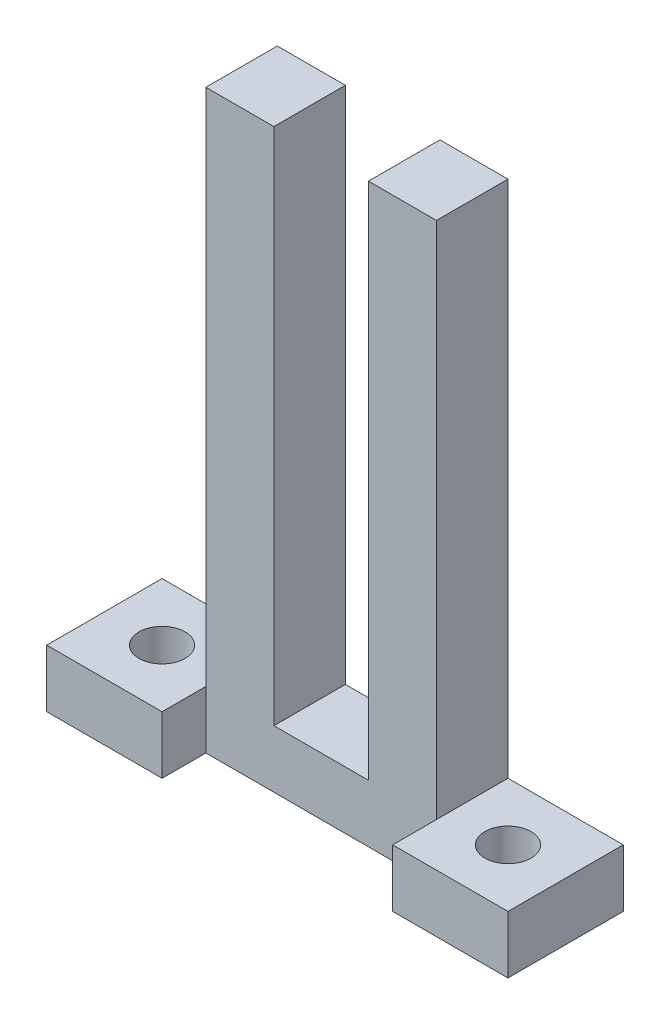
ISO-10303-21;
HEADER;
FILE_DESCRIPTION(('STEP AP214'),'2;1');
FILE_NAME('part.step','',(''),(''),'','','');
FILE_SCHEMA(('AUTOMOTIVE_DESIGN { 1 0 10303 214 1 1 1 1 }'));
ENDSEC;
DATA;
#1=APPLICATION_CONTEXT('core data for automotive mechanical design processes');
#2=APPLICATION_PROTOCOL_DEFINITION('international standard','automotive_design',2000,#1);
#3=PRODUCT_CONTEXT('',#1,'mechanical');
#4=PRODUCT('Part','Part','',(#3));
#5=PRODUCT_RELATED_PRODUCT_CATEGORY('part','',(#4));
#6=PRODUCT_DEFINITION_FORMATION('','',#4);
#7=PRODUCT_DEFINITION_CONTEXT('part definition',#1,'design');
#8=PRODUCT_DEFINITION('design','',#6,#7);
#9=PRODUCT_DEFINITION_SHAPE('','',#8);
#10=(LENGTH_UNIT() NAMED_UNIT(*) SI_UNIT(.MILLI.,.METRE.));
#11=(NAMED_UNIT(*) PLANE_ANGLE_UNIT() SI_UNIT($,.RADIAN.));
#12=(NAMED_UNIT(*) SI_UNIT($,.STERADIAN.) SOLID_ANGLE_UNIT());
#13=UNCERTAINTY_MEASURE_WITH_UNIT(LENGTH_MEASURE(1.E-05),#10,'distance_accuracy_value','');
#14=(GEOMETRIC_REPRESENTATION_CONTEXT(3) GLOBAL_UNCERTAINTY_ASSIGNED_CONTEXT((#13)) GLOBAL_UNIT_ASSIGNED_CONTEXT((#10,
#11,#12)) REPRESENTATION_CONTEXT('',''));
#15=CARTESIAN_POINT('',(0.,0.,0.));
#16=DIRECTION('',(0.,0.,1.));
#17=DIRECTION('',(1.,0.,0.));
#18=AXIS2_PLACEMENT_3D('',#15,#16,#17);
#19=CARTESIAN_POINT('',(0.,50.,0.));
#20=DIRECTION('',(0.,0.,-1.));
#21=DIRECTION('',(-1.,0.,0.));
#22=AXIS2_PLACEMENT_3D('',#19,#20,#21);
#23=PLANE('',#22);
#24=DIRECTION('',(0.,-1.,0.));
#25=VECTOR('',#24,1.);
#26=CARTESIAN_POINT('',(20.,5.,0.));
#27=LINE('',#26,#25);
#28=CARTESIAN_POINT('',(20.,5.,0.));
#29=VERTEX_POINT('',#28);
#30=CARTESIAN_POINT('',(20.,0.,0.));
#31=VERTEX_POINT('',#30);
#32=EDGE_CURVE('E161',#29,#31,#27,.T.);
#33=ORIENTED_EDGE('',*,*,#32,.F.);
#34=DIRECTION('',(0.,-1.,0.));
#35=VECTOR('',#34,1.);
#36=CARTESIAN_POINT('',(20.,50.,0.));
#37=LINE('',#36,#35);
#38=CARTESIAN_POINT('',(20.,50.,0.));
#39=VERTEX_POINT('',#38);
#40=EDGE_CURVE('E200',#39,#29,#37,.T.);
#41=ORIENTED_EDGE('',*,*,#40,.F.);
#42=DIRECTION('',(1.,0.,0.));
#43=VECTOR('',#42,1.);
#44=CARTESIAN_POINT('',(14.1,50.,0.));
#45=LINE('',#44,#43);
#46=CARTESIAN_POINT('',(14.1,50.,0.));
#47=VERTEX_POINT('',#46);
#48=EDGE_CURVE('E188',#47,#39,#45,.T.);
#49=ORIENTED_EDGE('',*,*,#48,.F.);
#50=DIRECTION('',(0.,-1.,0.));
#51=VECTOR('',#50,1.);
#52=CARTESIAN_POINT('',(14.1,50.,0.));
#53=LINE('',#52,#51);
#54=CARTESIAN_POINT('',(14.1,5.,0.));
#55=VERTEX_POINT('',#54);
#56=EDGE_CURVE('E203',#47,#55,#53,.T.);
#57=ORIENTED_EDGE('',*,*,#56,.T.);
#58=DIRECTION('',(1.,0.,0.));
#59=VECTOR('',#58,1.);
#60=CARTESIAN_POINT('',(-10.,5.,0.));
#61=LINE('',#60,#59);
#62=CARTESIAN_POINT('',(5.9,5.,0.));
#63=VERTEX_POINT('',#62);
#64=EDGE_CURVE('E209',#63,#55,#61,.T.);
#65=ORIENTED_EDGE('',*,*,#64,.F.);
#66=DIRECTION('',(0.,-1.,0.));
#67=VECTOR('',#66,1.);
#68=CARTESIAN_POINT('',(5.9,50.,0.));
#69=LINE('',#68,#67);
#70=CARTESIAN_POINT('',(5.9,50.,0.));
#71=VERTEX_POINT('',#70);
#72=EDGE_CURVE('E286',#71,#63,#69,.T.);
#73=ORIENTED_EDGE('',*,*,#72,.F.);
#74=DIRECTION('',(1.,0.,0.));
#75=VECTOR('',#74,1.);
#76=CARTESIAN_POINT('',(0.,50.,0.));
#77=LINE('',#76,#75);
#78=CARTESIAN_POINT('',(0.,50.,0.));
#79=VERTEX_POINT('',#78);
#80=EDGE_CURVE('E234',#79,#71,#77,.T.);
#81=ORIENTED_EDGE('',*,*,#80,.F.);
#82=DIRECTION('',(0.,-1.,0.));
#83=VECTOR('',#82,1.);
#84=CARTESIAN_POINT('',(0.,50.,0.));
#85=LINE('',#84,#83);
#86=CARTESIAN_POINT('',(0.,5.,0.));
#87=VERTEX_POINT('',#86);
#88=EDGE_CURVE('E263',#79,#87,#85,.T.);
#89=ORIENTED_EDGE('',*,*,#88,.T.);
#90=DIRECTION('',(0.,1.,0.));
#91=VECTOR('',#90,1.);
#92=CARTESIAN_POINT('',(0.,5.,0.));
#93=LINE('',#92,#91);
#94=CARTESIAN_POINT('',(0.,0.,0.));
#95=VERTEX_POINT('',#94);
#96=EDGE_CURVE('E48',#95,#87,#93,.T.);
#97=ORIENTED_EDGE('',*,*,#96,.F.);
#98=DIRECTION('',(1.,0.,0.));
#99=VECTOR('',#98,1.);
#100=CARTESIAN_POINT('',(0.,0.,0.));
#101=LINE('',#100,#99);
#102=EDGE_CURVE('E230',#95,#31,#101,.T.);
#103=ORIENTED_EDGE('',*,*,#102,.T.);
#104=EDGE_LOOP('',(#33,#41,#49,#57,#65,#73,#81,#89,#97,#103));
#105=FACE_BOUND('',#104,.T.);
#106=ADVANCED_FACE('F31',(#105),#23,.F.);
#107=CARTESIAN_POINT('',(-10.,5.,0.));
#108=DIRECTION('',(0.,1.,0.));
#109=DIRECTION('',(0.,0.,1.));
#110=AXIS2_PLACEMENT_3D('',#107,#108,#109);
#111=PLANE('',#110);
#112=ORIENTED_EDGE('',*,*,#64,.T.);
#113=DIRECTION('',(0.,0.,-1.));
#114=VECTOR('',#113,1.);
#115=CARTESIAN_POINT('',(14.1,5.,0.));
#116=LINE('',#115,#114);
#117=CARTESIAN_POINT('',(14.1,5.,-6.2));
#118=VERTEX_POINT('',#117);
#119=EDGE_CURVE('E11',#55,#118,#116,.T.);
#120=ORIENTED_EDGE('',*,*,#119,.T.);
#121=DIRECTION('',(-1.,0.,0.));
#122=VECTOR('',#121,1.);
#123=CARTESIAN_POINT('',(-10.,5.,-6.2));
#124=LINE('',#123,#122);
#125=CARTESIAN_POINT('',(5.9,5.,-6.2));
#126=VERTEX_POINT('',#125);
#127=EDGE_CURVE('E216',#118,#126,#124,.T.);
#128=ORIENTED_EDGE('',*,*,#127,.T.);
#129=DIRECTION('',(0.,0.,-1.));
#130=VECTOR('',#129,1.);
#131=CARTESIAN_POINT('',(5.9,5.,0.));
#132=LINE('',#131,#130);
#133=EDGE_CURVE('E224',#63,#126,#132,.T.);
#134=ORIENTED_EDGE('',*,*,#133,.F.);
#135=EDGE_LOOP('',(#112,#120,#128,#134));
#136=FACE_BOUND('',#135,.T.);
#137=ADVANCED_FACE('F277',(#136),#111,.T.);
#138=CARTESIAN_POINT('',(25.,5.,-1.2));
#139=DIRECTION('',(0.,1.,0.));
#140=DIRECTION('',(0.,0.,1.));
#141=AXIS2_PLACEMENT_3D('',#138,#139,#140);
#142=CIRCLE('',#141,2.);
#143=CARTESIAN_POINT('',(25.,5.,0.800000000000003));
#144=VERTEX_POINT('',#143);
#145=EDGE_CURVE('E259',#144,#144,#142,.T.);
#146=ORIENTED_EDGE('',*,*,#145,.F.);
#147=EDGE_LOOP('',(#146));
#148=FACE_BOUND('',#147,.T.);
#149=CARTESIAN_POINT('',(30.,5.,-6.2));
#150=VERTEX_POINT('',#149);
#151=CARTESIAN_POINT('',(20.,5.,-6.2));
#152=VERTEX_POINT('',#151);
#153=EDGE_CURVE('E56',#150,#152,#124,.T.);
#154=ORIENTED_EDGE('',*,*,#153,.T.);
#155=DIRECTION('',(0.,0.,1.));
#156=VECTOR('',#155,1.);
#157=CARTESIAN_POINT('',(20.,5.,0.));
#158=LINE('',#157,#156);
#159=EDGE_CURVE('E40',#152,#29,#158,.T.);
#160=ORIENTED_EDGE('',*,*,#159,.T.);
#161=DIRECTION('',(0.,0.,-1.));
#162=VECTOR('',#161,1.);
#163=CARTESIAN_POINT('',(20.,5.,3.8));
#164=LINE('',#163,#162);
#165=CARTESIAN_POINT('',(20.,5.,3.8));
#166=VERTEX_POINT('',#165);
#167=EDGE_CURVE('E165',#166,#29,#164,.T.);
#168=ORIENTED_EDGE('',*,*,#167,.F.);
#169=DIRECTION('',(-1.,0.,0.));
#170=VECTOR('',#169,1.);
#171=CARTESIAN_POINT('',(20.,5.,3.8));
#172=LINE('',#171,#170);
#173=CARTESIAN_POINT('',(30.,5.,3.8));
#174=VERTEX_POINT('',#173);
#175=EDGE_CURVE('E158',#174,#166,#172,.T.);
#176=ORIENTED_EDGE('',*,*,#175,.F.);
#177=DIRECTION('',(0.,0.,-1.));
#178=VECTOR('',#177,1.);
#179=CARTESIAN_POINT('',(30.,5.,-6.2));
#180=LINE('',#179,#178);
#181=EDGE_CURVE('E211',#174,#150,#180,.T.);
#182=ORIENTED_EDGE('',*,*,#181,.T.);
#183=EDGE_LOOP('',(#154,#160,#168,#176,#182));
#184=FACE_BOUND('',#183,.T.);
#185=ADVANCED_FACE('F260',(#148,#184),#111,.T.);
#186=CARTESIAN_POINT('',(0.,50.,0.));
#187=DIRECTION('',(1.,0.,0.));
#188=DIRECTION('',(0.,0.,-1.));
#189=AXIS2_PLACEMENT_3D('',#186,#187,#188);
#190=PLANE('',#189);
#191=DIRECTION('',(0.,-1.,0.));
#192=VECTOR('',#191,1.);
#193=CARTESIAN_POINT('',(0.,50.,-6.2));
#194=LINE('',#193,#192);
#195=CARTESIAN_POINT('',(0.,50.,-6.2));
#196=VERTEX_POINT('',#195);
#197=CARTESIAN_POINT('',(0.,5.,-6.2));
#198=VERTEX_POINT('',#197);
#199=EDGE_CURVE('E241',#196,#198,#194,.T.);
#200=ORIENTED_EDGE('',*,*,#199,.T.);
#201=DIRECTION('',(0.,0.,1.));
#202=VECTOR('',#201,1.);
#203=CARTESIAN_POINT('',(0.,5.,0.));
#204=LINE('',#203,#202);
#205=EDGE_CURVE('E227',#198,#87,#204,.T.);
#206=ORIENTED_EDGE('',*,*,#205,.T.);
#207=ORIENTED_EDGE('',*,*,#88,.F.);
#208=DIRECTION('',(0.,0.,1.));
#209=VECTOR('',#208,1.);
#210=CARTESIAN_POINT('',(0.,50.,0.));
#211=LINE('',#210,#209);
#212=EDGE_CURVE('E231',#196,#79,#211,.T.);
#213=ORIENTED_EDGE('',*,*,#212,.F.);
#214=EDGE_LOOP('',(#200,#206,#207,#213));
#215=FACE_BOUND('',#214,.T.);
#216=ADVANCED_FACE('F33',(#215),#190,.F.);
#217=CARTESIAN_POINT('',(5.9,50.,0.));
#218=DIRECTION('',(-1.,0.,0.));
#219=DIRECTION('',(0.,0.,1.));
#220=AXIS2_PLACEMENT_3D('',#217,#218,#219);
#221=PLANE('',#220);
#222=ORIENTED_EDGE('',*,*,#72,.T.);
#223=ORIENTED_EDGE('',*,*,#133,.T.);
#224=DIRECTION('',(0.,-1.,0.));
#225=VECTOR('',#224,1.);
#226=CARTESIAN_POINT('',(5.9,50.,-6.2));
#227=LINE('',#226,#225);
#228=CARTESIAN_POINT('',(5.9,50.,-6.2));
#229=VERTEX_POINT('',#228);
#230=EDGE_CURVE('E284',#229,#126,#227,.T.);
#231=ORIENTED_EDGE('',*,*,#230,.F.);
#232=DIRECTION('',(0.,0.,-1.));
#233=VECTOR('',#232,1.);
#234=CARTESIAN_POINT('',(5.9,50.,0.));
#235=LINE('',#234,#233);
#236=EDGE_CURVE('E237',#71,#229,#235,.T.);
#237=ORIENTED_EDGE('',*,*,#236,.F.);
#238=EDGE_LOOP('',(#222,#223,#231,#237));
#239=FACE_BOUND('',#238,.T.);
#240=ADVANCED_FACE('F282',(#239),#221,.F.);
#241=CARTESIAN_POINT('',(0.,50.,-6.2));
#242=DIRECTION('',(0.,0.,1.));
#243=DIRECTION('',(1.,0.,0.));
#244=AXIS2_PLACEMENT_3D('',#241,#242,#243);
#245=PLANE('',#244);
#246=DIRECTION('',(-1.,0.,0.));
#247=VECTOR('',#246,1.);
#248=CARTESIAN_POINT('',(0.,0.,-6.2));
#249=LINE('',#248,#247);
#250=CARTESIAN_POINT('',(30.,0.,-6.2));
#251=VERTEX_POINT('',#250);
#252=CARTESIAN_POINT('',(-10.,0.,-6.2));
#253=VERTEX_POINT('',#252);
#254=EDGE_CURVE('E235',#251,#253,#249,.T.);
#255=ORIENTED_EDGE('',*,*,#254,.T.);
#256=DIRECTION('',(0.,-1.,0.));
#257=VECTOR('',#256,1.);
#258=CARTESIAN_POINT('',(-10.,5.,-6.2));
#259=LINE('',#258,#257);
#260=CARTESIAN_POINT('',(-10.,5.,-6.2));
#261=VERTEX_POINT('',#260);
#262=EDGE_CURVE('E215',#261,#253,#259,.T.);
#263=ORIENTED_EDGE('',*,*,#262,.F.);
#264=EDGE_CURVE('E213',#198,#261,#124,.T.);
#265=ORIENTED_EDGE('',*,*,#264,.F.);
#266=ORIENTED_EDGE('',*,*,#199,.F.);
#267=DIRECTION('',(-1.,0.,0.));
#268=VECTOR('',#267,1.);
#269=CARTESIAN_POINT('',(0.,50.,-6.2));
#270=LINE('',#269,#268);
#271=EDGE_CURVE('E239',#229,#196,#270,.T.);
#272=ORIENTED_EDGE('',*,*,#271,.F.);
#273=ORIENTED_EDGE('',*,*,#230,.T.);
#274=ORIENTED_EDGE('',*,*,#127,.F.);
#275=DIRECTION('',(0.,-1.,0.));
#276=VECTOR('',#275,1.);
#277=CARTESIAN_POINT('',(14.1,50.,-6.2));
#278=LINE('',#277,#276);
#279=CARTESIAN_POINT('',(14.1,50.,-6.2));
#280=VERTEX_POINT('',#279);
#281=EDGE_CURVE('E194',#280,#118,#278,.T.);
#282=ORIENTED_EDGE('',*,*,#281,.F.);
#283=DIRECTION('',(-1.,0.,0.));
#284=VECTOR('',#283,1.);
#285=CARTESIAN_POINT('',(14.1,50.,-6.2));
#286=LINE('',#285,#284);
#287=CARTESIAN_POINT('',(20.,50.,-6.2));
#288=VERTEX_POINT('',#287);
#289=EDGE_CURVE('E192',#288,#280,#286,.T.);
#290=ORIENTED_EDGE('',*,*,#289,.F.);
#291=DIRECTION('',(0.,-1.,0.));
#292=VECTOR('',#291,1.);
#293=CARTESIAN_POINT('',(20.,50.,-6.2));
#294=LINE('',#293,#292);
#295=EDGE_CURVE('E197',#288,#152,#294,.T.);
#296=ORIENTED_EDGE('',*,*,#295,.T.);
#297=ORIENTED_EDGE('',*,*,#153,.F.);
#298=DIRECTION('',(0.,-1.,0.));
#299=VECTOR('',#298,1.);
#300=CARTESIAN_POINT('',(30.,5.,-6.2));
#301=LINE('',#300,#299);
#302=EDGE_CURVE('E221',#150,#251,#301,.T.);
#303=ORIENTED_EDGE('',*,*,#302,.T.);
#304=EDGE_LOOP('',(#255,#263,#265,#266,#272,#273,#274,#282,#290,#296,#297,#303));
#305=FACE_BOUND('',#304,.T.);
#306=ADVANCED_FACE('F288',(#305),#245,.F.);
#307=CARTESIAN_POINT('',(0.,50.,-6.2));
#308=DIRECTION('',(0.,-1.,0.));
#309=DIRECTION('',(0.,0.,-1.));
#310=AXIS2_PLACEMENT_3D('',#307,#308,#309);
#311=PLANE('',#310);
#312=ORIENTED_EDGE('',*,*,#212,.T.);
#313=ORIENTED_EDGE('',*,*,#80,.T.);
#314=ORIENTED_EDGE('',*,*,#236,.T.);
#315=ORIENTED_EDGE('',*,*,#271,.T.);
#316=EDGE_LOOP('',(#312,#313,#314,#315));
#317=FACE_BOUND('',#316,.T.);
#318=ADVANCED_FACE('F326',(#317),#311,.F.);
#319=CARTESIAN_POINT('',(0.,0.,-6.2));
#320=DIRECTION('',(0.,-1.,0.));
#321=DIRECTION('',(0.,0.,-1.));
#322=AXIS2_PLACEMENT_3D('',#319,#320,#321);
#323=PLANE('',#322);
#324=CARTESIAN_POINT('',(-5.,0.,-1.2));
#325=DIRECTION('',(0.,-1.,0.));
#326=DIRECTION('',(0.,0.,-1.));
#327=AXIS2_PLACEMENT_3D('',#324,#325,#326);
#328=CIRCLE('',#327,2.);
#329=CARTESIAN_POINT('',(-5.,0.,-3.2));
#330=VERTEX_POINT('',#329);
#331=EDGE_CURVE('E430',#330,#330,#328,.F.);
#332=ORIENTED_EDGE('',*,*,#331,.T.);
#333=EDGE_LOOP('',(#332));
#334=FACE_BOUND('',#333,.T.);
#335=CARTESIAN_POINT('',(25.,0.,-1.2));
#336=DIRECTION('',(0.,-1.,0.));
#337=DIRECTION('',(0.,0.,-1.));
#338=AXIS2_PLACEMENT_3D('',#335,#336,#337);
#339=CIRCLE('',#338,2.);
#340=CARTESIAN_POINT('',(25.,0.,-3.2));
#341=VERTEX_POINT('',#340);
#342=EDGE_CURVE('E434',#341,#341,#339,.F.);
#343=ORIENTED_EDGE('',*,*,#342,.T.);
#344=EDGE_LOOP('',(#343));
#345=FACE_BOUND('',#344,.T.);
#346=DIRECTION('',(0.,0.,-1.));
#347=VECTOR('',#346,1.);
#348=CARTESIAN_POINT('',(30.,0.,-6.2));
#349=LINE('',#348,#347);
#350=CARTESIAN_POINT('',(30.,0.,3.8));
#351=VERTEX_POINT('',#350);
#352=EDGE_CURVE('E148',#351,#251,#349,.T.);
#353=ORIENTED_EDGE('',*,*,#352,.F.);
#354=DIRECTION('',(1.,0.,0.));
#355=VECTOR('',#354,1.);
#356=CARTESIAN_POINT('',(20.,0.,3.8));
#357=LINE('',#356,#355);
#358=CARTESIAN_POINT('',(20.,0.,3.8));
#359=VERTEX_POINT('',#358);
#360=EDGE_CURVE('E141',#359,#351,#357,.T.);
#361=ORIENTED_EDGE('',*,*,#360,.F.);
#362=DIRECTION('',(0.,0.,-1.));
#363=VECTOR('',#362,1.);
#364=CARTESIAN_POINT('',(20.,0.,3.8));
#365=LINE('',#364,#363);
#366=EDGE_CURVE('E145',#359,#31,#365,.T.);
#367=ORIENTED_EDGE('',*,*,#366,.T.);
#368=ORIENTED_EDGE('',*,*,#102,.F.);
#369=DIRECTION('',(0.,0.,-1.));
#370=VECTOR('',#369,1.);
#371=CARTESIAN_POINT('',(0.,0.,3.8));
#372=LINE('',#371,#370);
#373=CARTESIAN_POINT('',(0.,0.,3.8));
#374=VERTEX_POINT('',#373);
#375=EDGE_CURVE('E184',#374,#95,#372,.T.);
#376=ORIENTED_EDGE('',*,*,#375,.F.);
#377=DIRECTION('',(1.,0.,0.));
#378=VECTOR('',#377,1.);
#379=CARTESIAN_POINT('',(-10.,0.,3.8));
#380=LINE('',#379,#378);
#381=CARTESIAN_POINT('',(-10.,0.,3.8));
#382=VERTEX_POINT('',#381);
#383=EDGE_CURVE('E174',#382,#374,#380,.T.);
#384=ORIENTED_EDGE('',*,*,#383,.F.);
#385=DIRECTION('',(0.,0.,1.));
#386=VECTOR('',#385,1.);
#387=CARTESIAN_POINT('',(-10.,0.,-6.2));
#388=LINE('',#387,#386);
#389=EDGE_CURVE('E206',#253,#382,#388,.T.);
#390=ORIENTED_EDGE('',*,*,#389,.F.);
#391=ORIENTED_EDGE('',*,*,#254,.F.);
#392=EDGE_LOOP('',(#353,#361,#367,#368,#376,#384,#390,#391));
#393=FACE_BOUND('',#392,.T.);
#394=ADVANCED_FACE('F143',(#334,#345,#393),#323,.T.);
#395=CARTESIAN_POINT('',(30.,5.,-6.2));
#396=DIRECTION('',(-1.,0.,0.));
#397=DIRECTION('',(0.,0.,1.));
#398=AXIS2_PLACEMENT_3D('',#395,#396,#397);
#399=PLANE('',#398);
#400=ORIENTED_EDGE('',*,*,#352,.T.);
#401=ORIENTED_EDGE('',*,*,#302,.F.);
#402=ORIENTED_EDGE('',*,*,#181,.F.);
#403=DIRECTION('',(0.,1.,0.));
#404=VECTOR('',#403,1.);
#405=CARTESIAN_POINT('',(30.,5.,3.8));
#406=LINE('',#405,#404);
#407=EDGE_CURVE('E152',#351,#174,#406,.T.);
#408=ORIENTED_EDGE('',*,*,#407,.F.);
#409=EDGE_LOOP('',(#400,#401,#402,#408));
#410=FACE_BOUND('',#409,.T.);
#411=ADVANCED_FACE('F329',(#410),#399,.F.);
#412=CARTESIAN_POINT('',(-5.,5.,-1.2));
#413=DIRECTION('',(0.,1.,0.));
#414=DIRECTION('',(0.,0.,1.));
#415=AXIS2_PLACEMENT_3D('',#412,#413,#414);
#416=CIRCLE('',#415,2.);
#417=CARTESIAN_POINT('',(-5.,5.,0.800000000000001));
#418=VERTEX_POINT('',#417);
#419=EDGE_CURVE('E433',#418,#418,#416,.T.);
#420=ORIENTED_EDGE('',*,*,#419,.F.);
#421=EDGE_LOOP('',(#420));
#422=FACE_BOUND('',#421,.T.);
#423=ORIENTED_EDGE('',*,*,#205,.F.);
#424=ORIENTED_EDGE('',*,*,#264,.T.);
#425=DIRECTION('',(0.,0.,1.));
#426=VECTOR('',#425,1.);
#427=CARTESIAN_POINT('',(-10.,5.,-6.2));
#428=LINE('',#427,#426);
#429=CARTESIAN_POINT('',(-10.,5.,3.8));
#430=VERTEX_POINT('',#429);
#431=EDGE_CURVE('E207',#261,#430,#428,.T.);
#432=ORIENTED_EDGE('',*,*,#431,.T.);
#433=DIRECTION('',(-1.,0.,0.));
#434=VECTOR('',#433,1.);
#435=CARTESIAN_POINT('',(-10.,5.,3.8));
#436=LINE('',#435,#434);
#437=CARTESIAN_POINT('',(0.,5.,3.8));
#438=VERTEX_POINT('',#437);
#439=EDGE_CURVE('E178',#438,#430,#436,.T.);
#440=ORIENTED_EDGE('',*,*,#439,.F.);
#441=DIRECTION('',(0.,0.,-1.));
#442=VECTOR('',#441,1.);
#443=CARTESIAN_POINT('',(0.,5.,3.8));
#444=LINE('',#443,#442);
#445=EDGE_CURVE('E181',#438,#87,#444,.T.);
#446=ORIENTED_EDGE('',*,*,#445,.T.);
#447=EDGE_LOOP('',(#423,#424,#432,#440,#446));
#448=FACE_BOUND('',#447,.T.);
#449=ADVANCED_FACE('F299',(#422,#448),#111,.T.);
#450=CARTESIAN_POINT('',(-10.,5.,-6.2));
#451=DIRECTION('',(1.,0.,0.));
#452=DIRECTION('',(0.,0.,-1.));
#453=AXIS2_PLACEMENT_3D('',#450,#451,#452);
#454=PLANE('',#453);
#455=ORIENTED_EDGE('',*,*,#389,.T.);
#456=DIRECTION('',(0.,-1.,0.));
#457=VECTOR('',#456,1.);
#458=CARTESIAN_POINT('',(-10.,5.,3.8));
#459=LINE('',#458,#457);
#460=EDGE_CURVE('E167',#430,#382,#459,.T.);
#461=ORIENTED_EDGE('',*,*,#460,.F.);
#462=ORIENTED_EDGE('',*,*,#431,.F.);
#463=ORIENTED_EDGE('',*,*,#262,.T.);
#464=EDGE_LOOP('',(#455,#461,#462,#463));
#465=FACE_BOUND('',#464,.T.);
#466=ADVANCED_FACE('F305',(#465),#454,.F.);
#467=CARTESIAN_POINT('',(14.1,50.,0.));
#468=DIRECTION('',(1.,0.,0.));
#469=DIRECTION('',(0.,0.,-1.));
#470=AXIS2_PLACEMENT_3D('',#467,#468,#469);
#471=PLANE('',#470);
#472=ORIENTED_EDGE('',*,*,#119,.F.);
#473=ORIENTED_EDGE('',*,*,#56,.F.);
#474=DIRECTION('',(0.,0.,1.));
#475=VECTOR('',#474,1.);
#476=CARTESIAN_POINT('',(14.1,50.,0.));
#477=LINE('',#476,#475);
#478=EDGE_CURVE('E185',#280,#47,#477,.T.);
#479=ORIENTED_EDGE('',*,*,#478,.F.);
#480=ORIENTED_EDGE('',*,*,#281,.T.);
#481=EDGE_LOOP('',(#472,#473,#479,#480));
#482=FACE_BOUND('',#481,.T.);
#483=ADVANCED_FACE('F275',(#482),#471,.F.);
#484=CARTESIAN_POINT('',(20.,50.,0.));
#485=DIRECTION('',(-1.,0.,0.));
#486=DIRECTION('',(0.,0.,1.));
#487=AXIS2_PLACEMENT_3D('',#484,#485,#486);
#488=PLANE('',#487);
#489=ORIENTED_EDGE('',*,*,#159,.F.);
#490=ORIENTED_EDGE('',*,*,#295,.F.);
#491=DIRECTION('',(0.,0.,-1.));
#492=VECTOR('',#491,1.);
#493=CARTESIAN_POINT('',(20.,50.,0.));
#494=LINE('',#493,#492);
#495=EDGE_CURVE('E190',#39,#288,#494,.T.);
#496=ORIENTED_EDGE('',*,*,#495,.F.);
#497=ORIENTED_EDGE('',*,*,#40,.T.);
#498=EDGE_LOOP('',(#489,#490,#496,#497));
#499=FACE_BOUND('',#498,.T.);
#500=ADVANCED_FACE('F264',(#499),#488,.F.);
#501=CARTESIAN_POINT('',(14.1,50.,-6.2));
#502=DIRECTION('',(0.,-1.,0.));
#503=DIRECTION('',(0.,0.,-1.));
#504=AXIS2_PLACEMENT_3D('',#501,#502,#503);
#505=PLANE('',#504);
#506=ORIENTED_EDGE('',*,*,#478,.T.);
#507=ORIENTED_EDGE('',*,*,#48,.T.);
#508=ORIENTED_EDGE('',*,*,#495,.T.);
#509=ORIENTED_EDGE('',*,*,#289,.T.);
#510=EDGE_LOOP('',(#506,#507,#508,#509));
#511=FACE_BOUND('',#510,.T.);
#512=ADVANCED_FACE('F267',(#511),#505,.F.);
#513=CARTESIAN_POINT('',(0.,5.,3.8));
#514=DIRECTION('',(-1.,0.,0.));
#515=DIRECTION('',(0.,0.,1.));
#516=AXIS2_PLACEMENT_3D('',#513,#514,#515);
#517=PLANE('',#516);
#518=ORIENTED_EDGE('',*,*,#96,.T.);
#519=ORIENTED_EDGE('',*,*,#445,.F.);
#520=DIRECTION('',(0.,1.,0.));
#521=VECTOR('',#520,1.);
#522=CARTESIAN_POINT('',(0.,5.,3.8));
#523=LINE('',#522,#521);
#524=EDGE_CURVE('E176',#374,#438,#523,.T.);
#525=ORIENTED_EDGE('',*,*,#524,.F.);
#526=ORIENTED_EDGE('',*,*,#375,.T.);
#527=EDGE_LOOP('',(#518,#519,#525,#526));
#528=FACE_BOUND('',#527,.T.);
#529=ADVANCED_FACE('F253',(#528),#517,.F.);
#530=CARTESIAN_POINT('',(-10.,0.,3.8));
#531=DIRECTION('',(0.,0.,1.));
#532=DIRECTION('',(1.,0.,0.));
#533=AXIS2_PLACEMENT_3D('',#530,#531,#532);
#534=PLANE('',#533);
#535=ORIENTED_EDGE('',*,*,#460,.T.);
#536=ORIENTED_EDGE('',*,*,#383,.T.);
#537=ORIENTED_EDGE('',*,*,#524,.T.);
#538=ORIENTED_EDGE('',*,*,#439,.T.);
#539=EDGE_LOOP('',(#535,#536,#537,#538));
#540=FACE_BOUND('',#539,.T.);
#541=ADVANCED_FACE('F307',(#540),#534,.T.);
#542=CARTESIAN_POINT('',(20.,5.,3.8));
#543=DIRECTION('',(1.,0.,0.));
#544=DIRECTION('',(0.,0.,-1.));
#545=AXIS2_PLACEMENT_3D('',#542,#543,#544);
#546=PLANE('',#545);
#547=ORIENTED_EDGE('',*,*,#32,.T.);
#548=ORIENTED_EDGE('',*,*,#366,.F.);
#549=DIRECTION('',(0.,-1.,0.));
#550=VECTOR('',#549,1.);
#551=CARTESIAN_POINT('',(20.,5.,3.8));
#552=LINE('',#551,#550);
#553=EDGE_CURVE('E153',#166,#359,#552,.T.);
#554=ORIENTED_EDGE('',*,*,#553,.F.);
#555=ORIENTED_EDGE('',*,*,#167,.T.);
#556=EDGE_LOOP('',(#547,#548,#554,#555));
#557=FACE_BOUND('',#556,.T.);
#558=ADVANCED_FACE('F163',(#557),#546,.F.);
#559=CARTESIAN_POINT('',(20.,0.,3.8));
#560=DIRECTION('',(0.,0.,1.));
#561=DIRECTION('',(1.,0.,0.));
#562=AXIS2_PLACEMENT_3D('',#559,#560,#561);
#563=PLANE('',#562);
#564=ORIENTED_EDGE('',*,*,#553,.T.);
#565=ORIENTED_EDGE('',*,*,#360,.T.);
#566=ORIENTED_EDGE('',*,*,#407,.T.);
#567=ORIENTED_EDGE('',*,*,#175,.T.);
#568=EDGE_LOOP('',(#564,#565,#566,#567));
#569=FACE_BOUND('',#568,.T.);
#570=ADVANCED_FACE('F156',(#569),#563,.T.);
#571=CARTESIAN_POINT('',(25.,-0.00104999999999984,-1.2));
#572=DIRECTION('',(0.,1.,0.));
#573=DIRECTION('',(0.,0.,1.));
#574=AXIS2_PLACEMENT_3D('',#571,#572,#573);
#575=CYLINDRICAL_SURFACE('',#574,2.);
#576=ORIENTED_EDGE('',*,*,#342,.F.);
#577=EDGE_LOOP('',(#576));
#578=FACE_BOUND('',#577,.T.);
#579=ORIENTED_EDGE('',*,*,#145,.T.);
#580=EDGE_LOOP('',(#579));
#581=FACE_BOUND('',#580,.T.);
#582=ADVANCED_FACE('F378',(#578,#581),#575,.F.);
#583=CARTESIAN_POINT('',(-5.,-0.00104999999999984,-1.2));
#584=DIRECTION('',(0.,1.,0.));
#585=DIRECTION('',(0.,0.,1.));
#586=AXIS2_PLACEMENT_3D('',#583,#584,#585);
#587=CYLINDRICAL_SURFACE('',#586,2.);
#588=ORIENTED_EDGE('',*,*,#331,.F.);
#589=EDGE_LOOP('',(#588));
#590=FACE_BOUND('',#589,.T.);
#591=ORIENTED_EDGE('',*,*,#419,.T.);
#592=EDGE_LOOP('',(#591));
#593=FACE_BOUND('',#592,.T.);
#594=ADVANCED_FACE('F413',(#590,#593),#587,.F.);
#595=CLOSED_SHELL('',(#106,#137,#185,#216,#240,#306,#318,#394,#411,#449,#466,#483,#500,#512,
#529,#541,#558,#570,#582,#594));
#596=MANIFOLD_SOLID_BREP('B2',#595);
#597=ADVANCED_BREP_SHAPE_REPRESENTATION('',(#18,#596),#14);
#598=SHAPE_DEFINITION_REPRESENTATION(#9,#597);
ENDSEC;
END-ISO-10303-21;
